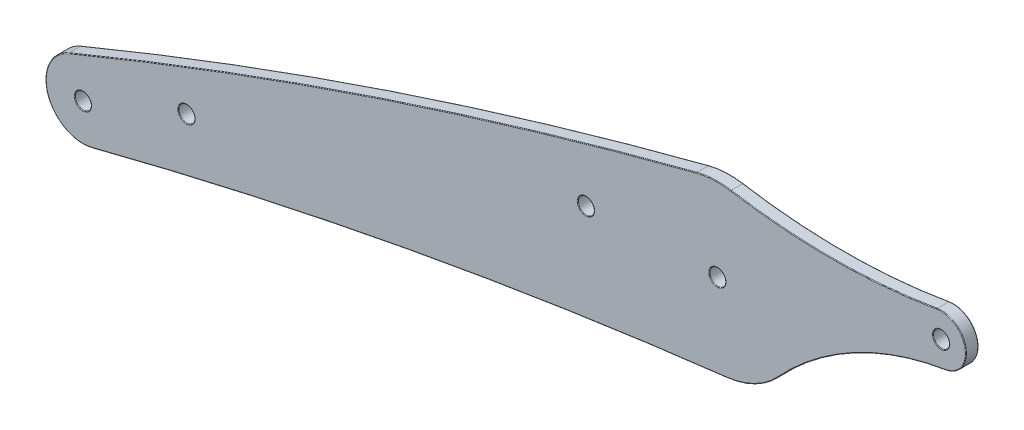
ISO-10303-21;
HEADER;
FILE_DESCRIPTION(('STEP AP214'),'2;1');
FILE_NAME('part.step','',(''),(''),'','','');
FILE_SCHEMA(('AUTOMOTIVE_DESIGN { 1 0 10303 214 1 1 1 1 }'));
ENDSEC;
DATA;
#1=APPLICATION_CONTEXT('core data for automotive mechanical design processes');
#2=APPLICATION_PROTOCOL_DEFINITION('international standard','automotive_design',2000,#1);
#3=PRODUCT_CONTEXT('',#1,'mechanical');
#4=PRODUCT('Part','Part','',(#3));
#5=PRODUCT_RELATED_PRODUCT_CATEGORY('part','',(#4));
#6=PRODUCT_DEFINITION_FORMATION('','',#4);
#7=PRODUCT_DEFINITION_CONTEXT('part definition',#1,'design');
#8=PRODUCT_DEFINITION('design','',#6,#7);
#9=PRODUCT_DEFINITION_SHAPE('','',#8);
#10=(LENGTH_UNIT() NAMED_UNIT(*) SI_UNIT(.MILLI.,.METRE.));
#11=(NAMED_UNIT(*) PLANE_ANGLE_UNIT() SI_UNIT($,.RADIAN.));
#12=(NAMED_UNIT(*) SI_UNIT($,.STERADIAN.) SOLID_ANGLE_UNIT());
#13=UNCERTAINTY_MEASURE_WITH_UNIT(LENGTH_MEASURE(1.E-05),#10,'distance_accuracy_value','');
#14=(GEOMETRIC_REPRESENTATION_CONTEXT(3) GLOBAL_UNCERTAINTY_ASSIGNED_CONTEXT((#13)) GLOBAL_UNIT_ASSIGNED_CONTEXT((#10,
#11,#12)) REPRESENTATION_CONTEXT('',''));
#15=CARTESIAN_POINT('',(0.,0.,0.));
#16=DIRECTION('',(0.,0.,1.));
#17=DIRECTION('',(1.,0.,0.));
#18=AXIS2_PLACEMENT_3D('',#15,#16,#17);
#19=CARTESIAN_POINT('',(-11.0780148603004,289.384113579825,0.));
#20=DIRECTION('',(0.,0.,-1.));
#21=DIRECTION('',(-1.,0.,0.));
#22=AXIS2_PLACEMENT_3D('',#19,#20,#21);
#23=PLANE('',#22);
#24=CARTESIAN_POINT('',(-177.991557982178,165.76962250211,0.));
#25=DIRECTION('',(0.,0.,-1.));
#26=DIRECTION('',(-1.,0.,0.));
#27=AXIS2_PLACEMENT_3D('',#24,#25,#26);
#28=CIRCLE('',#27,2.10000000000001);
#29=CARTESIAN_POINT('',(-180.091557982178,165.76962250211,0.));
#30=VERTEX_POINT('',#29);
#31=EDGE_CURVE('E11',#30,#30,#28,.T.);
#32=ORIENTED_EDGE('',*,*,#31,.T.);
#33=EDGE_LOOP('',(#32));
#34=FACE_BOUND('',#33,.T.);
#35=CARTESIAN_POINT('',(-152.991557982178,175.545617404976,0.));
#36=DIRECTION('',(0.,0.,-1.));
#37=DIRECTION('',(-1.,0.,0.));
#38=AXIS2_PLACEMENT_3D('',#35,#36,#37);
#39=CIRCLE('',#38,2.10000000000001);
#40=CARTESIAN_POINT('',(-155.091557982178,175.545617404976,0.));
#41=VERTEX_POINT('',#40);
#42=EDGE_CURVE('E42',#41,#41,#39,.T.);
#43=ORIENTED_EDGE('',*,*,#42,.T.);
#44=EDGE_LOOP('',(#43));
#45=FACE_BOUND('',#44,.T.);
#46=CARTESIAN_POINT('',(-56.5865231427907,204.525451112236,0.));
#47=DIRECTION('',(0.,0.,-1.));
#48=DIRECTION('',(-1.,0.,0.));
#49=AXIS2_PLACEMENT_3D('',#46,#47,#48);
#50=CIRCLE('',#49,2.1);
#51=CARTESIAN_POINT('',(-58.6865231427907,204.525451112236,0.));
#52=VERTEX_POINT('',#51);
#53=EDGE_CURVE('E296',#52,#52,#50,.T.);
#54=ORIENTED_EDGE('',*,*,#53,.T.);
#55=EDGE_LOOP('',(#54));
#56=FACE_BOUND('',#55,.T.);
#57=CARTESIAN_POINT('',(-24.8517146991871,205.507506633977,0.));
#58=DIRECTION('',(0.,0.,-1.));
#59=DIRECTION('',(-1.,0.,0.));
#60=AXIS2_PLACEMENT_3D('',#57,#58,#59);
#61=CIRCLE('',#60,2.1);
#62=CARTESIAN_POINT('',(-26.9517146991871,205.507506633977,0.));
#63=VERTEX_POINT('',#62);
#64=EDGE_CURVE('E293',#63,#63,#61,.T.);
#65=ORIENTED_EDGE('',*,*,#64,.T.);
#66=EDGE_LOOP('',(#65));
#67=FACE_BOUND('',#66,.T.);
#68=CARTESIAN_POINT('',(29.1482853008129,219.519834824463,0.));
#69=DIRECTION('',(0.,0.,-1.));
#70=DIRECTION('',(-1.,0.,0.));
#71=AXIS2_PLACEMENT_3D('',#68,#69,#70);
#72=CIRCLE('',#71,2.1);
#73=CARTESIAN_POINT('',(27.0482853008129,219.519834824463,0.));
#74=VERTEX_POINT('',#73);
#75=EDGE_CURVE('E290',#74,#74,#72,.T.);
#76=ORIENTED_EDGE('',*,*,#75,.T.);
#77=EDGE_LOOP('',(#76));
#78=FACE_BOUND('',#77,.T.);
#79=CARTESIAN_POINT('',(29.1482853008129,219.519834824463,0.));
#80=DIRECTION('',(0.,0.,-1.));
#81=DIRECTION('',(-1.,0.,0.));
#82=AXIS2_PLACEMENT_3D('',#79,#80,#81);
#83=CIRCLE('',#82,5.85000000000002);
#84=CARTESIAN_POINT('',(30.0848388911669,213.745290048258,0.));
#85=VERTEX_POINT('',#84);
#86=CARTESIAN_POINT('',(28.1563127887294,225.285118038258,0.));
#87=VERTEX_POINT('',#86);
#88=EDGE_CURVE('E50',#85,#87,#83,.F.);
#89=ORIENTED_EDGE('',*,*,#88,.T.);
#90=CARTESIAN_POINT('',(2.69568497858623,373.260720525673,0.));
#91=DIRECTION('',(0.,0.,-1.));
#92=DIRECTION('',(-1.,0.,0.));
#93=AXIS2_PLACEMENT_3D('',#90,#91,#92);
#94=CIRCLE('',#93,150.15);
#95=CARTESIAN_POINT('',(-21.6351506779884,225.095161314861,0.));
#96=VERTEX_POINT('',#95);
#97=EDGE_CURVE('E288',#87,#96,#94,.T.);
#98=ORIENTED_EDGE('',*,*,#97,.T.);
#99=CARTESIAN_POINT('',(-24.8517146991871,205.507506633977,0.));
#100=DIRECTION('',(0.,0.,-1.));
#101=DIRECTION('',(-1.,0.,0.));
#102=AXIS2_PLACEMENT_3D('',#99,#100,#101);
#103=CIRCLE('',#102,19.85);
#104=CARTESIAN_POINT('',(-29.8347415885378,224.721874773992,0.));
#105=VERTEX_POINT('',#104);
#106=EDGE_CURVE('E276',#96,#105,#103,.F.);
#107=ORIENTED_EDGE('',*,*,#106,.T.);
#108=CARTESIAN_POINT('',(258.816818548486,-888.307908893301,0.));
#109=DIRECTION('',(0.,0.,-1.));
#110=DIRECTION('',(-1.,0.,0.));
#111=AXIS2_PLACEMENT_3D('',#108,#109,#110);
#112=CIRCLE('',#111,1149.85);
#113=CARTESIAN_POINT('',(-181.379598413638,173.945421058508,0.));
#114=VERTEX_POINT('',#113);
#115=EDGE_CURVE('E278',#105,#114,#112,.F.);
#116=ORIENTED_EDGE('',*,*,#115,.T.);
#117=CARTESIAN_POINT('',(-177.991557982178,165.76962250211,0.));
#118=DIRECTION('',(0.,0.,-1.));
#119=DIRECTION('',(-1.,0.,0.));
#120=AXIS2_PLACEMENT_3D('',#117,#118,#119);
#121=CIRCLE('',#120,8.8499999999999);
#122=CARTESIAN_POINT('',(-175.782450037665,157.199771739729,0.));
#123=VERTEX_POINT('',#122);
#124=EDGE_CURVE('E280',#114,#123,#121,.F.);
#125=ORIENTED_EDGE('',*,*,#124,.T.);
#126=CARTESIAN_POINT('',(111.314216898068,-956.541906718248,0.));
#127=DIRECTION('',(0.,0.,-1.));
#128=DIRECTION('',(-1.,0.,0.));
#129=AXIS2_PLACEMENT_3D('',#126,#127,#128);
#130=CIRCLE('',#129,1150.15);
#131=CARTESIAN_POINT('',(-22.5415491075585,185.792394792061,0.));
#132=VERTEX_POINT('',#131);
#133=EDGE_CURVE('E282',#123,#132,#130,.T.);
#134=ORIENTED_EDGE('',*,*,#133,.T.);
#135=CARTESIAN_POINT('',(-24.8517146991871,205.507506633977,0.));
#136=DIRECTION('',(0.,0.,-1.));
#137=DIRECTION('',(-1.,0.,0.));
#138=AXIS2_PLACEMENT_3D('',#135,#136,#137);
#139=CIRCLE('',#138,19.8500000000001);
#140=CARTESIAN_POINT('',(-10.2581729206342,192.051985894978,0.));
#141=VERTEX_POINT('',#140);
#142=EDGE_CURVE('E284',#132,#141,#139,.F.);
#143=ORIENTED_EDGE('',*,*,#142,.T.);
#144=CARTESIAN_POINT('',(41.3154772438735,144.500107817357,0.));
#145=DIRECTION('',(0.,0.,-1.));
#146=DIRECTION('',(-1.,0.,0.));
#147=AXIS2_PLACEMENT_3D('',#144,#145,#146);
#148=CIRCLE('',#147,70.15);
#149=EDGE_CURVE('E55',#141,#85,#148,.T.);
#150=ORIENTED_EDGE('',*,*,#149,.T.);
#151=EDGE_LOOP('',(#89,#98,#107,#116,#125,#134,#143,#150));
#152=FACE_BOUND('',#151,.T.);
#153=ADVANCED_FACE('F33',(#34,#45,#56,#67,#78,#152),#23,.F.);
#154=CARTESIAN_POINT('',(-24.8517146991871,205.507506633977,-3.));
#155=DIRECTION('',(0.,0.,1.));
#156=DIRECTION('',(1.,0.,0.));
#157=AXIS2_PLACEMENT_3D('',#154,#155,#156);
#158=CYLINDRICAL_SURFACE('',#157,20.);
#159=DIRECTION('',(0.,0.,1.));
#160=VECTOR('',#159,1.);
#161=CARTESIAN_POINT('',(-21.6108441488609,225.24317885653,-3.));
#162=LINE('',#161,#160);
#163=CARTESIAN_POINT('',(-21.6108441488609,225.24317885653,-2.85));
#164=VERTEX_POINT('',#163);
#165=CARTESIAN_POINT('',(-21.6108441488609,225.24317885653,-0.15));
#166=VERTEX_POINT('',#165);
#167=EDGE_CURVE('E155',#164,#166,#162,.T.);
#168=ORIENTED_EDGE('',*,*,#167,.F.);
#169=CARTESIAN_POINT('',(-24.8517146991871,205.507506633977,-2.85));
#170=DIRECTION('',(0.,0.,-1.));
#171=DIRECTION('',(-1.,0.,0.));
#172=AXIS2_PLACEMENT_3D('',#169,#170,#171);
#173=CIRCLE('',#172,20.);
#174=CARTESIAN_POINT('',(-29.8723967035707,224.867071510566,-2.85));
#175=VERTEX_POINT('',#174);
#176=EDGE_CURVE('E149',#164,#175,#173,.F.);
#177=ORIENTED_EDGE('',*,*,#176,.T.);
#178=DIRECTION('',(0.,0.,1.));
#179=VECTOR('',#178,1.);
#180=CARTESIAN_POINT('',(-29.8723967035707,224.867071510566,-3.));
#181=LINE('',#180,#179);
#182=CARTESIAN_POINT('',(-29.8723967035707,224.867071510566,-0.15));
#183=VERTEX_POINT('',#182);
#184=EDGE_CURVE('E152',#175,#183,#181,.T.);
#185=ORIENTED_EDGE('',*,*,#184,.T.);
#186=CARTESIAN_POINT('',(-24.8517146991871,205.507506633977,-0.15));
#187=DIRECTION('',(0.,0.,-1.));
#188=DIRECTION('',(-1.,0.,0.));
#189=AXIS2_PLACEMENT_3D('',#186,#187,#188);
#190=CIRCLE('',#189,20.);
#191=EDGE_CURVE('E161',#183,#166,#190,.T.);
#192=ORIENTED_EDGE('',*,*,#191,.T.);
#193=EDGE_LOOP('',(#168,#177,#185,#192));
#194=FACE_BOUND('',#193,.T.);
#195=ADVANCED_FACE('F151',(#194),#158,.T.);
#196=CARTESIAN_POINT('',(2.69568497858623,373.260720525673,-3.));
#197=DIRECTION('',(0.,0.,1.));
#198=DIRECTION('',(1.,0.,0.));
#199=AXIS2_PLACEMENT_3D('',#196,#197,#198);
#200=CYLINDRICAL_SURFACE('',#199,150.);
#201=DIRECTION('',(0.,0.,1.));
#202=VECTOR('',#201,1.);
#203=CARTESIAN_POINT('',(28.1308775961118,225.432945812971,-3.));
#204=LINE('',#203,#202);
#205=CARTESIAN_POINT('',(28.1308775961118,225.432945812971,-2.85));
#206=VERTEX_POINT('',#205);
#207=CARTESIAN_POINT('',(28.1308775961118,225.432945812971,-0.15));
#208=VERTEX_POINT('',#207);
#209=EDGE_CURVE('E369',#206,#208,#204,.T.);
#210=ORIENTED_EDGE('',*,*,#209,.F.);
#211=CARTESIAN_POINT('',(2.69568497858623,373.260720525673,-2.85));
#212=DIRECTION('',(0.,0.,-1.));
#213=DIRECTION('',(-1.,0.,0.));
#214=AXIS2_PLACEMENT_3D('',#211,#212,#213);
#215=CIRCLE('',#214,150.);
#216=EDGE_CURVE('E244',#206,#164,#215,.T.);
#217=ORIENTED_EDGE('',*,*,#216,.T.);
#218=ORIENTED_EDGE('',*,*,#167,.T.);
#219=CARTESIAN_POINT('',(2.69568497858623,373.260720525673,-0.15));
#220=DIRECTION('',(0.,0.,-1.));
#221=DIRECTION('',(-1.,0.,0.));
#222=AXIS2_PLACEMENT_3D('',#219,#220,#221);
#223=CIRCLE('',#222,150.);
#224=EDGE_CURVE('E241',#166,#208,#223,.F.);
#225=ORIENTED_EDGE('',*,*,#224,.T.);
#226=EDGE_LOOP('',(#210,#217,#218,#225));
#227=FACE_BOUND('',#226,.T.);
#228=ADVANCED_FACE('F375',(#227),#200,.F.);
#229=CARTESIAN_POINT('',(29.1482853008129,219.519834824463,-3.));
#230=DIRECTION('',(0.,0.,1.));
#231=DIRECTION('',(1.,0.,0.));
#232=AXIS2_PLACEMENT_3D('',#229,#230,#231);
#233=CYLINDRICAL_SURFACE('',#232,6.00000000000002);
#234=DIRECTION('',(0.,0.,1.));
#235=VECTOR('',#234,1.);
#236=CARTESIAN_POINT('',(30.1088530857914,213.597224797586,-3.));
#237=LINE('',#236,#235);
#238=CARTESIAN_POINT('',(30.1088530857914,213.597224797586,-2.85));
#239=VERTEX_POINT('',#238);
#240=CARTESIAN_POINT('',(30.1088530857914,213.597224797586,-0.15));
#241=VERTEX_POINT('',#240);
#242=EDGE_CURVE('E366',#239,#241,#237,.T.);
#243=ORIENTED_EDGE('',*,*,#242,.F.);
#244=CARTESIAN_POINT('',(29.1482853008129,219.519834824463,-2.85));
#245=DIRECTION('',(0.,0.,-1.));
#246=DIRECTION('',(-1.,0.,0.));
#247=AXIS2_PLACEMENT_3D('',#244,#245,#246);
#248=CIRCLE('',#247,6.00000000000002);
#249=EDGE_CURVE('E239',#239,#206,#248,.F.);
#250=ORIENTED_EDGE('',*,*,#249,.T.);
#251=ORIENTED_EDGE('',*,*,#209,.T.);
#252=CARTESIAN_POINT('',(29.1482853008129,219.519834824463,-0.15));
#253=DIRECTION('',(0.,0.,-1.));
#254=DIRECTION('',(-1.,0.,0.));
#255=AXIS2_PLACEMENT_3D('',#252,#253,#254);
#256=CIRCLE('',#255,6.00000000000002);
#257=EDGE_CURVE('E237',#208,#241,#256,.T.);
#258=ORIENTED_EDGE('',*,*,#257,.T.);
#259=EDGE_LOOP('',(#243,#250,#251,#258));
#260=FACE_BOUND('',#259,.T.);
#261=ADVANCED_FACE('F401',(#260),#233,.T.);
#262=CARTESIAN_POINT('',(41.3154772438735,144.500107817357,-3.));
#263=DIRECTION('',(0.,0.,1.));
#264=DIRECTION('',(1.,0.,0.));
#265=AXIS2_PLACEMENT_3D('',#262,#263,#264);
#266=CYLINDRICAL_SURFACE('',#265,70.);
#267=DIRECTION('',(0.,0.,1.));
#268=VECTOR('',#267,1.);
#269=CARTESIAN_POINT('',(-10.1478942673958,191.95030689695,-3.));
#270=LINE('',#269,#268);
#271=CARTESIAN_POINT('',(-10.1478942673958,191.95030689695,-2.85));
#272=VERTEX_POINT('',#271);
#273=CARTESIAN_POINT('',(-10.1478942673958,191.95030689695,-0.15));
#274=VERTEX_POINT('',#273);
#275=EDGE_CURVE('E360',#272,#274,#270,.T.);
#276=ORIENTED_EDGE('',*,*,#275,.F.);
#277=CARTESIAN_POINT('',(41.3154772438735,144.500107817357,-2.85));
#278=DIRECTION('',(0.,0.,-1.));
#279=DIRECTION('',(-1.,0.,0.));
#280=AXIS2_PLACEMENT_3D('',#277,#278,#279);
#281=CIRCLE('',#280,70.);
#282=EDGE_CURVE('E235',#272,#239,#281,.T.);
#283=ORIENTED_EDGE('',*,*,#282,.T.);
#284=ORIENTED_EDGE('',*,*,#242,.T.);
#285=CARTESIAN_POINT('',(41.3154772438735,144.500107817357,-0.15));
#286=DIRECTION('',(0.,0.,-1.));
#287=DIRECTION('',(-1.,0.,0.));
#288=AXIS2_PLACEMENT_3D('',#285,#286,#287);
#289=CIRCLE('',#288,70.);
#290=EDGE_CURVE('E233',#241,#274,#289,.F.);
#291=ORIENTED_EDGE('',*,*,#290,.T.);
#292=EDGE_LOOP('',(#276,#283,#284,#291));
#293=FACE_BOUND('',#292,.T.);
#294=ADVANCED_FACE('F404',(#293),#266,.F.);
#295=CARTESIAN_POINT('',(-24.8517146991871,205.507506633977,-3.));
#296=DIRECTION('',(0.,0.,1.));
#297=DIRECTION('',(1.,0.,0.));
#298=AXIS2_PLACEMENT_3D('',#295,#296,#297);
#299=CYLINDRICAL_SURFACE('',#298,20.0000000000001);
#300=DIRECTION('',(0.,0.,1.));
#301=VECTOR('',#300,1.);
#302=CARTESIAN_POINT('',(-22.5240919368409,185.643414098042,-3.));
#303=LINE('',#302,#301);
#304=CARTESIAN_POINT('',(-22.5240919368409,185.643414098042,-2.85));
#305=VERTEX_POINT('',#304);
#306=CARTESIAN_POINT('',(-22.5240919368409,185.643414098042,-0.15));
#307=VERTEX_POINT('',#306);
#308=EDGE_CURVE('E356',#305,#307,#303,.T.);
#309=ORIENTED_EDGE('',*,*,#308,.F.);
#310=CARTESIAN_POINT('',(-24.8517146991871,205.507506633977,-2.85));
#311=DIRECTION('',(0.,0.,-1.));
#312=DIRECTION('',(-1.,0.,0.));
#313=AXIS2_PLACEMENT_3D('',#310,#311,#312);
#314=CIRCLE('',#313,20.0000000000001);
#315=EDGE_CURVE('E231',#305,#272,#314,.F.);
#316=ORIENTED_EDGE('',*,*,#315,.T.);
#317=ORIENTED_EDGE('',*,*,#275,.T.);
#318=CARTESIAN_POINT('',(-24.8517146991871,205.507506633977,-0.15));
#319=DIRECTION('',(0.,0.,-1.));
#320=DIRECTION('',(-1.,0.,0.));
#321=AXIS2_PLACEMENT_3D('',#318,#319,#320);
#322=CIRCLE('',#321,20.0000000000001);
#323=EDGE_CURVE('E229',#274,#307,#322,.T.);
#324=ORIENTED_EDGE('',*,*,#323,.T.);
#325=EDGE_LOOP('',(#309,#316,#317,#324));
#326=FACE_BOUND('',#325,.T.);
#327=ADVANCED_FACE('F408',(#326),#299,.T.);
#328=CARTESIAN_POINT('',(111.314216898068,-956.541906718248,-3.));
#329=DIRECTION('',(0.,0.,1.));
#330=DIRECTION('',(1.,0.,0.));
#331=AXIS2_PLACEMENT_3D('',#328,#329,#330);
#332=CYLINDRICAL_SURFACE('',#331,1150.);
#333=DIRECTION('',(0.,0.,1.));
#334=VECTOR('',#333,1.);
#335=CARTESIAN_POINT('',(-175.745007530131,157.054520031892,-3.));
#336=LINE('',#335,#334);
#337=CARTESIAN_POINT('',(-175.745007530131,157.054520031892,-2.85));
#338=VERTEX_POINT('',#337);
#339=CARTESIAN_POINT('',(-175.745007530131,157.054520031892,-0.15));
#340=VERTEX_POINT('',#339);
#341=EDGE_CURVE('E353',#338,#340,#336,.T.);
#342=ORIENTED_EDGE('',*,*,#341,.F.);
#343=CARTESIAN_POINT('',(111.314216898068,-956.541906718248,-2.85));
#344=DIRECTION('',(0.,0.,-1.));
#345=DIRECTION('',(-1.,0.,0.));
#346=AXIS2_PLACEMENT_3D('',#343,#344,#345);
#347=CIRCLE('',#346,1150.);
#348=EDGE_CURVE('E227',#338,#305,#347,.T.);
#349=ORIENTED_EDGE('',*,*,#348,.T.);
#350=ORIENTED_EDGE('',*,*,#308,.T.);
#351=CARTESIAN_POINT('',(111.314216898068,-956.541906718248,-0.15));
#352=DIRECTION('',(0.,0.,-1.));
#353=DIRECTION('',(-1.,0.,0.));
#354=AXIS2_PLACEMENT_3D('',#351,#352,#353);
#355=CIRCLE('',#354,1150.);
#356=EDGE_CURVE('E225',#307,#340,#355,.F.);
#357=ORIENTED_EDGE('',*,*,#356,.T.);
#358=EDGE_LOOP('',(#342,#349,#350,#357));
#359=FACE_BOUND('',#358,.T.);
#360=ADVANCED_FACE('F352',(#359),#332,.F.);
#361=CARTESIAN_POINT('',(-177.991557982178,165.76962250211,-3.));
#362=DIRECTION('',(0.,0.,1.));
#363=DIRECTION('',(1.,0.,0.));
#364=AXIS2_PLACEMENT_3D('',#361,#362,#363);
#365=CYLINDRICAL_SURFACE('',#364,8.9999999999999);
#366=DIRECTION('',(0.,0.,1.));
#367=VECTOR('',#366,1.);
#368=CARTESIAN_POINT('',(-181.437022827731,174.083993915396,-3.));
#369=LINE('',#368,#367);
#370=CARTESIAN_POINT('',(-181.437022827731,174.083993915396,-2.85));
#371=VERTEX_POINT('',#370);
#372=CARTESIAN_POINT('',(-181.437022827731,174.083993915396,-0.15));
#373=VERTEX_POINT('',#372);
#374=EDGE_CURVE('E172',#371,#373,#369,.T.);
#375=ORIENTED_EDGE('',*,*,#374,.F.);
#376=CARTESIAN_POINT('',(-177.991557982178,165.76962250211,-2.85));
#377=DIRECTION('',(0.,0.,-1.));
#378=DIRECTION('',(-1.,0.,0.));
#379=AXIS2_PLACEMENT_3D('',#376,#377,#378);
#380=CIRCLE('',#379,8.9999999999999);
#381=EDGE_CURVE('E223',#371,#338,#380,.F.);
#382=ORIENTED_EDGE('',*,*,#381,.T.);
#383=ORIENTED_EDGE('',*,*,#341,.T.);
#384=CARTESIAN_POINT('',(-177.991557982178,165.76962250211,-0.15));
#385=DIRECTION('',(0.,0.,-1.));
#386=DIRECTION('',(-1.,0.,0.));
#387=AXIS2_PLACEMENT_3D('',#384,#385,#386);
#388=CIRCLE('',#387,8.9999999999999);
#389=EDGE_CURVE('E221',#340,#373,#388,.T.);
#390=ORIENTED_EDGE('',*,*,#389,.T.);
#391=EDGE_LOOP('',(#375,#382,#383,#390));
#392=FACE_BOUND('',#391,.T.);
#393=ADVANCED_FACE('F358',(#392),#365,.T.);
#394=CARTESIAN_POINT('',(258.816818548486,-888.307908893301,-3.));
#395=DIRECTION('',(0.,0.,1.));
#396=DIRECTION('',(1.,0.,0.));
#397=AXIS2_PLACEMENT_3D('',#394,#395,#396);
#398=CYLINDRICAL_SURFACE('',#397,1150.);
#399=ORIENTED_EDGE('',*,*,#184,.F.);
#400=CARTESIAN_POINT('',(258.816818548486,-888.307908893301,-2.85));
#401=DIRECTION('',(0.,0.,-1.));
#402=DIRECTION('',(-1.,0.,0.));
#403=AXIS2_PLACEMENT_3D('',#400,#401,#402);
#404=CIRCLE('',#403,1150.);
#405=EDGE_CURVE('E168',#175,#371,#404,.F.);
#406=ORIENTED_EDGE('',*,*,#405,.T.);
#407=ORIENTED_EDGE('',*,*,#374,.T.);
#408=CARTESIAN_POINT('',(258.816818548486,-888.307908893301,-0.15));
#409=DIRECTION('',(0.,0.,-1.));
#410=DIRECTION('',(-1.,0.,0.));
#411=AXIS2_PLACEMENT_3D('',#408,#409,#410);
#412=CIRCLE('',#411,1150.);
#413=EDGE_CURVE('E171',#373,#183,#412,.T.);
#414=ORIENTED_EDGE('',*,*,#413,.T.);
#415=EDGE_LOOP('',(#399,#406,#407,#414));
#416=FACE_BOUND('',#415,.T.);
#417=ADVANCED_FACE('F165',(#416),#398,.T.);
#418=CARTESIAN_POINT('',(-11.0780148603004,289.384113579825,-3.));
#419=DIRECTION('',(0.,0.,-1.));
#420=DIRECTION('',(-1.,0.,0.));
#421=AXIS2_PLACEMENT_3D('',#418,#419,#420);
#422=PLANE('',#421);
#423=CARTESIAN_POINT('',(-177.991557982178,165.76962250211,-3.));
#424=DIRECTION('',(0.,0.,-1.));
#425=DIRECTION('',(-1.,0.,0.));
#426=AXIS2_PLACEMENT_3D('',#423,#424,#425);
#427=CIRCLE('',#426,8.8499999999999);
#428=CARTESIAN_POINT('',(-175.782450037665,157.199771739729,-3.));
#429=VERTEX_POINT('',#428);
#430=CARTESIAN_POINT('',(-181.379598413638,173.945421058508,-3.));
#431=VERTEX_POINT('',#430);
#432=EDGE_CURVE('E217',#429,#431,#427,.T.);
#433=ORIENTED_EDGE('',*,*,#432,.T.);
#434=CARTESIAN_POINT('',(258.816818548486,-888.307908893301,-3.));
#435=DIRECTION('',(0.,0.,-1.));
#436=DIRECTION('',(-1.,0.,0.));
#437=AXIS2_PLACEMENT_3D('',#434,#435,#436);
#438=CIRCLE('',#437,1149.85);
#439=CARTESIAN_POINT('',(-29.8347415885378,224.721874773992,-3.));
#440=VERTEX_POINT('',#439);
#441=EDGE_CURVE('E219',#431,#440,#438,.T.);
#442=ORIENTED_EDGE('',*,*,#441,.T.);
#443=CARTESIAN_POINT('',(-24.8517146991871,205.507506633977,-3.));
#444=DIRECTION('',(0.,0.,-1.));
#445=DIRECTION('',(-1.,0.,0.));
#446=AXIS2_PLACEMENT_3D('',#443,#444,#445);
#447=CIRCLE('',#446,19.85);
#448=CARTESIAN_POINT('',(-21.6351506779884,225.095161314861,-3.));
#449=VERTEX_POINT('',#448);
#450=EDGE_CURVE('E178',#440,#449,#447,.T.);
#451=ORIENTED_EDGE('',*,*,#450,.T.);
#452=CARTESIAN_POINT('',(2.69568497858623,373.260720525673,-3.));
#453=DIRECTION('',(0.,0.,-1.));
#454=DIRECTION('',(-1.,0.,0.));
#455=AXIS2_PLACEMENT_3D('',#452,#453,#454);
#456=CIRCLE('',#455,150.15);
#457=CARTESIAN_POINT('',(28.1563127887294,225.285118038258,-3.));
#458=VERTEX_POINT('',#457);
#459=EDGE_CURVE('E207',#449,#458,#456,.F.);
#460=ORIENTED_EDGE('',*,*,#459,.T.);
#461=CARTESIAN_POINT('',(29.1482853008129,219.519834824463,-3.));
#462=DIRECTION('',(0.,0.,-1.));
#463=DIRECTION('',(-1.,0.,0.));
#464=AXIS2_PLACEMENT_3D('',#461,#462,#463);
#465=CIRCLE('',#464,5.85000000000002);
#466=CARTESIAN_POINT('',(30.0848388911669,213.745290048258,-3.));
#467=VERTEX_POINT('',#466);
#468=EDGE_CURVE('E209',#458,#467,#465,.T.);
#469=ORIENTED_EDGE('',*,*,#468,.T.);
#470=CARTESIAN_POINT('',(41.3154772438735,144.500107817357,-3.));
#471=DIRECTION('',(0.,0.,-1.));
#472=DIRECTION('',(-1.,0.,0.));
#473=AXIS2_PLACEMENT_3D('',#470,#471,#472);
#474=CIRCLE('',#473,70.15);
#475=CARTESIAN_POINT('',(-10.2581729206343,192.051985894978,-3.));
#476=VERTEX_POINT('',#475);
#477=EDGE_CURVE('E211',#467,#476,#474,.F.);
#478=ORIENTED_EDGE('',*,*,#477,.T.);
#479=CARTESIAN_POINT('',(-24.8517146991871,205.507506633977,-3.));
#480=DIRECTION('',(0.,0.,-1.));
#481=DIRECTION('',(-1.,0.,0.));
#482=AXIS2_PLACEMENT_3D('',#479,#480,#481);
#483=CIRCLE('',#482,19.8500000000001);
#484=CARTESIAN_POINT('',(-22.5415491075585,185.792394792061,-3.));
#485=VERTEX_POINT('',#484);
#486=EDGE_CURVE('E213',#476,#485,#483,.T.);
#487=ORIENTED_EDGE('',*,*,#486,.T.);
#488=CARTESIAN_POINT('',(111.314216898068,-956.541906718248,-3.));
#489=DIRECTION('',(0.,0.,-1.));
#490=DIRECTION('',(-1.,0.,0.));
#491=AXIS2_PLACEMENT_3D('',#488,#489,#490);
#492=CIRCLE('',#491,1150.15);
#493=EDGE_CURVE('E215',#485,#429,#492,.F.);
#494=ORIENTED_EDGE('',*,*,#493,.T.);
#495=EDGE_LOOP('',(#433,#442,#451,#460,#469,#478,#487,#494));
#496=FACE_BOUND('',#495,.T.);
#497=CARTESIAN_POINT('',(29.1482853008129,219.519834824463,-3.));
#498=DIRECTION('',(0.,0.,-1.));
#499=DIRECTION('',(-1.,0.,0.));
#500=AXIS2_PLACEMENT_3D('',#497,#498,#499);
#501=CIRCLE('',#500,2.1);
#502=CARTESIAN_POINT('',(27.0482853008129,219.519834824463,-3.));
#503=VERTEX_POINT('',#502);
#504=EDGE_CURVE('E203',#503,#503,#501,.F.);
#505=ORIENTED_EDGE('',*,*,#504,.T.);
#506=EDGE_LOOP('',(#505));
#507=FACE_BOUND('',#506,.T.);
#508=CARTESIAN_POINT('',(-24.8517146991871,205.507506633977,-3.));
#509=DIRECTION('',(0.,0.,-1.));
#510=DIRECTION('',(-1.,0.,0.));
#511=AXIS2_PLACEMENT_3D('',#508,#509,#510);
#512=CIRCLE('',#511,2.1);
#513=CARTESIAN_POINT('',(-26.9517146991871,205.507506633977,-3.));
#514=VERTEX_POINT('',#513);
#515=EDGE_CURVE('E200',#514,#514,#512,.F.);
#516=ORIENTED_EDGE('',*,*,#515,.T.);
#517=EDGE_LOOP('',(#516));
#518=FACE_BOUND('',#517,.T.);
#519=CARTESIAN_POINT('',(-56.5865231427907,204.525451112236,-3.));
#520=DIRECTION('',(0.,0.,-1.));
#521=DIRECTION('',(-1.,0.,0.));
#522=AXIS2_PLACEMENT_3D('',#519,#520,#521);
#523=CIRCLE('',#522,2.1);
#524=CARTESIAN_POINT('',(-58.6865231427907,204.525451112236,-3.));
#525=VERTEX_POINT('',#524);
#526=EDGE_CURVE('E197',#525,#525,#523,.F.);
#527=ORIENTED_EDGE('',*,*,#526,.T.);
#528=EDGE_LOOP('',(#527));
#529=FACE_BOUND('',#528,.T.);
#530=CARTESIAN_POINT('',(-152.991557982178,175.545617404976,-3.));
#531=DIRECTION('',(0.,0.,-1.));
#532=DIRECTION('',(-1.,0.,0.));
#533=AXIS2_PLACEMENT_3D('',#530,#531,#532);
#534=CIRCLE('',#533,2.10000000000001);
#535=CARTESIAN_POINT('',(-155.091557982178,175.545617404976,-3.));
#536=VERTEX_POINT('',#535);
#537=EDGE_CURVE('E191',#536,#536,#534,.F.);
#538=ORIENTED_EDGE('',*,*,#537,.T.);
#539=EDGE_LOOP('',(#538));
#540=FACE_BOUND('',#539,.T.);
#541=CARTESIAN_POINT('',(-177.991557982178,165.76962250211,-3.));
#542=DIRECTION('',(0.,0.,-1.));
#543=DIRECTION('',(-1.,0.,0.));
#544=AXIS2_PLACEMENT_3D('',#541,#542,#543);
#545=CIRCLE('',#544,2.10000000000001);
#546=CARTESIAN_POINT('',(-180.091557982178,165.76962250211,-3.));
#547=VERTEX_POINT('',#546);
#548=EDGE_CURVE('E188',#547,#547,#545,.F.);
#549=ORIENTED_EDGE('',*,*,#548,.T.);
#550=EDGE_LOOP('',(#549));
#551=FACE_BOUND('',#550,.T.);
#552=ADVANCED_FACE('F397',(#496,#507,#518,#529,#540,#551),#422,.T.);
#553=CARTESIAN_POINT('',(29.1482853008129,219.519834824463,0.));
#554=DIRECTION('',(0.,0.,1.));
#555=DIRECTION('',(1.,0.,0.));
#556=AXIS2_PLACEMENT_3D('',#553,#554,#555);
#557=CYLINDRICAL_SURFACE('',#556,1.95);
#558=CARTESIAN_POINT('',(29.1482853008129,219.519834824463,-2.85));
#559=DIRECTION('',(0.,0.,-1.));
#560=DIRECTION('',(-1.,0.,0.));
#561=AXIS2_PLACEMENT_3D('',#558,#559,#560);
#562=CIRCLE('',#561,1.95);
#563=CARTESIAN_POINT('',(27.1982853008129,219.519834824463,-2.85));
#564=VERTEX_POINT('',#563);
#565=EDGE_CURVE('E249',#564,#564,#562,.T.);
#566=ORIENTED_EDGE('',*,*,#565,.T.);
#567=EDGE_LOOP('',(#566));
#568=FACE_BOUND('',#567,.T.);
#569=CARTESIAN_POINT('',(29.1482853008129,219.519834824463,-0.15));
#570=DIRECTION('',(0.,0.,-1.));
#571=DIRECTION('',(-1.,0.,0.));
#572=AXIS2_PLACEMENT_3D('',#569,#570,#571);
#573=CIRCLE('',#572,1.95);
#574=CARTESIAN_POINT('',(27.1982853008129,219.519834824463,-0.15));
#575=VERTEX_POINT('',#574);
#576=EDGE_CURVE('E160',#575,#575,#573,.F.);
#577=ORIENTED_EDGE('',*,*,#576,.T.);
#578=EDGE_LOOP('',(#577));
#579=FACE_BOUND('',#578,.T.);
#580=ADVANCED_FACE('F614',(#568,#579),#557,.F.);
#581=CARTESIAN_POINT('',(-24.8517146991871,205.507506633977,0.));
#582=DIRECTION('',(0.,0.,1.));
#583=DIRECTION('',(1.,0.,0.));
#584=AXIS2_PLACEMENT_3D('',#581,#582,#583);
#585=CYLINDRICAL_SURFACE('',#584,1.95);
#586=CARTESIAN_POINT('',(-24.8517146991871,205.507506633977,-2.85));
#587=DIRECTION('',(0.,0.,-1.));
#588=DIRECTION('',(-1.,0.,0.));
#589=AXIS2_PLACEMENT_3D('',#586,#587,#588);
#590=CIRCLE('',#589,1.95);
#591=CARTESIAN_POINT('',(-26.8017146991871,205.507506633977,-2.85));
#592=VERTEX_POINT('',#591);
#593=EDGE_CURVE('E255',#592,#592,#590,.T.);
#594=ORIENTED_EDGE('',*,*,#593,.T.);
#595=EDGE_LOOP('',(#594));
#596=FACE_BOUND('',#595,.T.);
#597=CARTESIAN_POINT('',(-24.8517146991871,205.507506633977,-0.15));
#598=DIRECTION('',(0.,0.,-1.));
#599=DIRECTION('',(-1.,0.,0.));
#600=AXIS2_PLACEMENT_3D('',#597,#598,#599);
#601=CIRCLE('',#600,1.95);
#602=CARTESIAN_POINT('',(-26.8017146991871,205.507506633977,-0.15));
#603=VERTEX_POINT('',#602);
#604=EDGE_CURVE('E252',#603,#603,#601,.F.);
#605=ORIENTED_EDGE('',*,*,#604,.T.);
#606=EDGE_LOOP('',(#605));
#607=FACE_BOUND('',#606,.T.);
#608=ADVANCED_FACE('F606',(#596,#607),#585,.F.);
#609=CARTESIAN_POINT('',(-56.5865231427907,204.525451112236,0.));
#610=DIRECTION('',(0.,0.,1.));
#611=DIRECTION('',(1.,0.,0.));
#612=AXIS2_PLACEMENT_3D('',#609,#610,#611);
#613=CYLINDRICAL_SURFACE('',#612,1.95);
#614=CARTESIAN_POINT('',(-56.5865231427907,204.525451112236,-2.85));
#615=DIRECTION('',(0.,0.,-1.));
#616=DIRECTION('',(-1.,0.,0.));
#617=AXIS2_PLACEMENT_3D('',#614,#615,#616);
#618=CIRCLE('',#617,1.95);
#619=CARTESIAN_POINT('',(-58.5365231427907,204.525451112236,-2.85));
#620=VERTEX_POINT('',#619);
#621=EDGE_CURVE('E261',#620,#620,#618,.T.);
#622=ORIENTED_EDGE('',*,*,#621,.T.);
#623=EDGE_LOOP('',(#622));
#624=FACE_BOUND('',#623,.T.);
#625=CARTESIAN_POINT('',(-56.5865231427907,204.525451112236,-0.15));
#626=DIRECTION('',(0.,0.,-1.));
#627=DIRECTION('',(-1.,0.,0.));
#628=AXIS2_PLACEMENT_3D('',#625,#626,#627);
#629=CIRCLE('',#628,1.95);
#630=CARTESIAN_POINT('',(-58.5365231427907,204.525451112236,-0.15));
#631=VERTEX_POINT('',#630);
#632=EDGE_CURVE('E258',#631,#631,#629,.F.);
#633=ORIENTED_EDGE('',*,*,#632,.T.);
#634=EDGE_LOOP('',(#633));
#635=FACE_BOUND('',#634,.T.);
#636=ADVANCED_FACE('F598',(#624,#635),#613,.F.);
#637=CARTESIAN_POINT('',(-152.991557982178,175.545617404976,0.));
#638=DIRECTION('',(0.,0.,1.));
#639=DIRECTION('',(1.,0.,0.));
#640=AXIS2_PLACEMENT_3D('',#637,#638,#639);
#641=CYLINDRICAL_SURFACE('',#640,1.95000000000001);
#642=CARTESIAN_POINT('',(-152.991557982178,175.545617404976,-2.85));
#643=DIRECTION('',(0.,0.,-1.));
#644=DIRECTION('',(-1.,0.,0.));
#645=AXIS2_PLACEMENT_3D('',#642,#643,#644);
#646=CIRCLE('',#645,1.95000000000001);
#647=CARTESIAN_POINT('',(-154.941557982178,175.545617404976,-2.85));
#648=VERTEX_POINT('',#647);
#649=EDGE_CURVE('E267',#648,#648,#646,.T.);
#650=ORIENTED_EDGE('',*,*,#649,.T.);
#651=EDGE_LOOP('',(#650));
#652=FACE_BOUND('',#651,.T.);
#653=CARTESIAN_POINT('',(-152.991557982178,175.545617404976,-0.15));
#654=DIRECTION('',(0.,0.,-1.));
#655=DIRECTION('',(-1.,0.,0.));
#656=AXIS2_PLACEMENT_3D('',#653,#654,#655);
#657=CIRCLE('',#656,1.95000000000001);
#658=CARTESIAN_POINT('',(-154.941557982178,175.545617404976,-0.15));
#659=VERTEX_POINT('',#658);
#660=EDGE_CURVE('E264',#659,#659,#657,.F.);
#661=ORIENTED_EDGE('',*,*,#660,.T.);
#662=EDGE_LOOP('',(#661));
#663=FACE_BOUND('',#662,.T.);
#664=ADVANCED_FACE('F590',(#652,#663),#641,.F.);
#665=CARTESIAN_POINT('',(-177.991557982178,165.76962250211,0.));
#666=DIRECTION('',(0.,0.,1.));
#667=DIRECTION('',(1.,0.,0.));
#668=AXIS2_PLACEMENT_3D('',#665,#666,#667);
#669=CYLINDRICAL_SURFACE('',#668,1.95000000000001);
#670=CARTESIAN_POINT('',(-177.991557982178,165.76962250211,-2.85));
#671=DIRECTION('',(0.,0.,-1.));
#672=DIRECTION('',(-1.,0.,0.));
#673=AXIS2_PLACEMENT_3D('',#670,#671,#672);
#674=CIRCLE('',#673,1.95000000000001);
#675=CARTESIAN_POINT('',(-179.941557982178,165.76962250211,-2.85));
#676=VERTEX_POINT('',#675);
#677=EDGE_CURVE('E273',#676,#676,#674,.T.);
#678=ORIENTED_EDGE('',*,*,#677,.T.);
#679=EDGE_LOOP('',(#678));
#680=FACE_BOUND('',#679,.T.);
#681=CARTESIAN_POINT('',(-177.991557982178,165.76962250211,-0.15));
#682=DIRECTION('',(0.,0.,-1.));
#683=DIRECTION('',(-1.,0.,0.));
#684=AXIS2_PLACEMENT_3D('',#681,#682,#683);
#685=CIRCLE('',#684,1.95000000000001);
#686=CARTESIAN_POINT('',(-179.941557982178,165.76962250211,-0.15));
#687=VERTEX_POINT('',#686);
#688=EDGE_CURVE('E270',#687,#687,#685,.F.);
#689=ORIENTED_EDGE('',*,*,#688,.T.);
#690=EDGE_LOOP('',(#689));
#691=FACE_BOUND('',#690,.T.);
#692=ADVANCED_FACE('F447',(#680,#691),#669,.F.);
#693=CARTESIAN_POINT('',(41.3154772438735,144.500107817357,-2.85));
#694=DIRECTION('',(0.,0.,-1.));
#695=DIRECTION('',(-1.,0.,0.));
#696=AXIS2_PLACEMENT_3D('',#693,#694,#695);
#697=TOROIDAL_SURFACE('',#696,70.15,0.15);
#698=CARTESIAN_POINT('',(-10.2581729206343,192.051985894978,-2.85));
#699=DIRECTION('',(-0.67785998685143,-0.735191021589477,0.));
#700=DIRECTION('',(0.735191021589477,-0.67785998685143,0.));
#701=AXIS2_PLACEMENT_3D('',#698,#699,#700);
#702=CIRCLE('',#701,0.15);
#703=EDGE_CURVE('E312',#476,#272,#702,.T.);
#704=ORIENTED_EDGE('',*,*,#703,.F.);
#705=ORIENTED_EDGE('',*,*,#477,.F.);
#706=CARTESIAN_POINT('',(30.0848388911669,213.745290048258,-2.85));
#707=DIRECTION('',(0.987101671146134,0.160094630829733,0.));
#708=DIRECTION('',(-0.160094630829733,0.987101671146134,0.));
#709=AXIS2_PLACEMENT_3D('',#706,#707,#708);
#710=CIRCLE('',#709,0.15);
#711=EDGE_CURVE('E173',#239,#467,#710,.T.);
#712=ORIENTED_EDGE('',*,*,#711,.F.);
#713=ORIENTED_EDGE('',*,*,#282,.F.);
#714=EDGE_LOOP('',(#704,#705,#712,#713));
#715=FACE_BOUND('',#714,.T.);
#716=ADVANCED_FACE('F443',(#715),#697,.T.);
#717=CARTESIAN_POINT('',(29.1482853008129,219.519834824463,-2.85));
#718=DIRECTION('',(0.,0.,-1.));
#719=DIRECTION('',(-1.,0.,0.));
#720=AXIS2_PLACEMENT_3D('',#717,#718,#719);
#721=TOROIDAL_SURFACE('',#720,5.85000000000002,0.15);
#722=ORIENTED_EDGE('',*,*,#711,.T.);
#723=ORIENTED_EDGE('',*,*,#468,.F.);
#724=CARTESIAN_POINT('',(28.1563127887294,225.285118038258,-2.85));
#725=DIRECTION('',(-0.985518498084678,-0.169567950783514,0.));
#726=DIRECTION('',(0.169567950783514,-0.985518498084678,0.));
#727=AXIS2_PLACEMENT_3D('',#724,#725,#726);
#728=CIRCLE('',#727,0.15);
#729=EDGE_CURVE('E309',#206,#458,#728,.T.);
#730=ORIENTED_EDGE('',*,*,#729,.F.);
#731=ORIENTED_EDGE('',*,*,#249,.F.);
#732=EDGE_LOOP('',(#722,#723,#730,#731));
#733=FACE_BOUND('',#732,.T.);
#734=ADVANCED_FACE('F439',(#733),#721,.T.);
#735=CARTESIAN_POINT('',(-24.8517146991871,205.507506633977,-2.85));
#736=DIRECTION('',(0.,0.,-1.));
#737=DIRECTION('',(-1.,0.,0.));
#738=AXIS2_PLACEMENT_3D('',#735,#736,#737);
#739=TOROIDAL_SURFACE('',#738,19.8500000000001,0.15);
#740=ORIENTED_EDGE('',*,*,#703,.T.);
#741=ORIENTED_EDGE('',*,*,#315,.F.);
#742=CARTESIAN_POINT('',(-22.5415491075585,185.792394792061,-2.85));
#743=DIRECTION('',(-0.993204626796774,-0.116381138117312,0.));
#744=DIRECTION('',(0.116381138117312,-0.993204626796774,0.));
#745=AXIS2_PLACEMENT_3D('',#742,#743,#744);
#746=CIRCLE('',#745,0.15);
#747=EDGE_CURVE('E306',#485,#305,#746,.T.);
#748=ORIENTED_EDGE('',*,*,#747,.F.);
#749=ORIENTED_EDGE('',*,*,#486,.F.);
#750=EDGE_LOOP('',(#740,#741,#748,#749));
#751=FACE_BOUND('',#750,.T.);
#752=ADVANCED_FACE('F435',(#751),#739,.T.);
#753=CARTESIAN_POINT('',(2.69568497858623,373.260720525673,-2.85));
#754=DIRECTION('',(0.,0.,-1.));
#755=DIRECTION('',(-1.,0.,0.));
#756=AXIS2_PLACEMENT_3D('',#753,#754,#755);
#757=TOROIDAL_SURFACE('',#756,150.15,0.15);
#758=ORIENTED_EDGE('',*,*,#729,.T.);
#759=ORIENTED_EDGE('',*,*,#459,.F.);
#760=CARTESIAN_POINT('',(-21.6351506779884,225.095161314861,-2.85));
#761=DIRECTION('',(-0.986783611127622,0.162043527516311,0.));
#762=DIRECTION('',(-0.162043527516311,-0.986783611127622,0.));
#763=AXIS2_PLACEMENT_3D('',#760,#761,#762);
#764=CIRCLE('',#763,0.15);
#765=EDGE_CURVE('E304',#164,#449,#764,.T.);
#766=ORIENTED_EDGE('',*,*,#765,.F.);
#767=ORIENTED_EDGE('',*,*,#216,.F.);
#768=EDGE_LOOP('',(#758,#759,#766,#767));
#769=FACE_BOUND('',#768,.T.);
#770=ADVANCED_FACE('F431',(#769),#757,.T.);
#771=CARTESIAN_POINT('',(111.314216898068,-956.541906718248,-2.85));
#772=DIRECTION('',(0.,0.,-1.));
#773=DIRECTION('',(-1.,0.,0.));
#774=AXIS2_PLACEMENT_3D('',#771,#772,#773);
#775=TOROIDAL_SURFACE('',#774,1150.15,0.15);
#776=ORIENTED_EDGE('',*,*,#747,.T.);
#777=ORIENTED_EDGE('',*,*,#348,.F.);
#778=CARTESIAN_POINT('',(-175.782450037665,157.199771739729,-2.85));
#779=DIRECTION('',(-0.968344718913144,-0.249616716894168,0.));
#780=DIRECTION('',(0.249616716894168,-0.968344718913144,0.));
#781=AXIS2_PLACEMENT_3D('',#778,#779,#780);
#782=CIRCLE('',#781,0.15);
#783=EDGE_CURVE('E182',#429,#338,#782,.T.);
#784=ORIENTED_EDGE('',*,*,#783,.F.);
#785=ORIENTED_EDGE('',*,*,#493,.F.);
#786=EDGE_LOOP('',(#776,#777,#784,#785));
#787=FACE_BOUND('',#786,.T.);
#788=ADVANCED_FACE('F428',(#787),#775,.T.);
#789=CARTESIAN_POINT('',(-24.8517146991871,205.507506633977,-2.85));
#790=DIRECTION('',(0.,0.,-1.));
#791=DIRECTION('',(-1.,0.,0.));
#792=AXIS2_PLACEMENT_3D('',#789,#790,#791);
#793=TOROIDAL_SURFACE('',#792,19.85,0.15);
#794=ORIENTED_EDGE('',*,*,#765,.T.);
#795=ORIENTED_EDGE('',*,*,#450,.F.);
#796=CARTESIAN_POINT('',(-29.8347415885378,224.721874773992,-2.85));
#797=DIRECTION('',(-0.967978243829455,-0.251034100219163,0.));
#798=DIRECTION('',(0.251034100219163,-0.967978243829455,0.));
#799=AXIS2_PLACEMENT_3D('',#796,#797,#798);
#800=CIRCLE('',#799,0.15);
#801=EDGE_CURVE('E176',#175,#440,#800,.T.);
#802=ORIENTED_EDGE('',*,*,#801,.F.);
#803=ORIENTED_EDGE('',*,*,#176,.F.);
#804=EDGE_LOOP('',(#794,#795,#802,#803));
#805=FACE_BOUND('',#804,.T.);
#806=ADVANCED_FACE('F177',(#805),#793,.T.);
#807=CARTESIAN_POINT('',(-177.991557982178,165.76962250211,-2.85));
#808=DIRECTION('',(0.,0.,-1.));
#809=DIRECTION('',(-1.,0.,0.));
#810=AXIS2_PLACEMENT_3D('',#807,#808,#809);
#811=TOROIDAL_SURFACE('',#810,8.8499999999999,0.15);
#812=ORIENTED_EDGE('',*,*,#783,.T.);
#813=ORIENTED_EDGE('',*,*,#381,.F.);
#814=CARTESIAN_POINT('',(-181.379598413638,173.945421058508,-2.85));
#815=DIRECTION('',(0.923819045920635,0.382829427283599,0.));
#816=DIRECTION('',(-0.382829427283599,0.923819045920635,0.));
#817=AXIS2_PLACEMENT_3D('',#814,#815,#816);
#818=CIRCLE('',#817,0.15);
#819=EDGE_CURVE('E183',#431,#371,#818,.T.);
#820=ORIENTED_EDGE('',*,*,#819,.F.);
#821=ORIENTED_EDGE('',*,*,#432,.F.);
#822=EDGE_LOOP('',(#812,#813,#820,#821));
#823=FACE_BOUND('',#822,.T.);
#824=ADVANCED_FACE('F422',(#823),#811,.T.);
#825=CARTESIAN_POINT('',(258.816818548486,-888.307908893301,-2.85));
#826=DIRECTION('',(0.,0.,-1.));
#827=DIRECTION('',(-1.,0.,0.));
#828=AXIS2_PLACEMENT_3D('',#825,#826,#827);
#829=TOROIDAL_SURFACE('',#828,1149.85,0.15);
#830=ORIENTED_EDGE('',*,*,#801,.T.);
#831=ORIENTED_EDGE('',*,*,#441,.F.);
#832=ORIENTED_EDGE('',*,*,#819,.T.);
#833=ORIENTED_EDGE('',*,*,#405,.F.);
#834=EDGE_LOOP('',(#830,#831,#832,#833));
#835=FACE_BOUND('',#834,.T.);
#836=ADVANCED_FACE('F185',(#835),#829,.T.);
#837=CARTESIAN_POINT('',(29.1482853008129,219.519834824463,-2.85));
#838=DIRECTION('',(0.,0.,-1.));
#839=DIRECTION('',(-1.,0.,0.));
#840=AXIS2_PLACEMENT_3D('',#837,#838,#839);
#841=TOROIDAL_SURFACE('',#840,2.1,0.15);
#842=ORIENTED_EDGE('',*,*,#504,.F.);
#843=EDGE_LOOP('',(#842));
#844=FACE_BOUND('',#843,.T.);
#845=ORIENTED_EDGE('',*,*,#565,.F.);
#846=EDGE_LOOP('',(#845));
#847=FACE_BOUND('',#846,.T.);
#848=ADVANCED_FACE('F421',(#844,#847),#841,.T.);
#849=CARTESIAN_POINT('',(-24.8517146991871,205.507506633977,-2.85));
#850=DIRECTION('',(0.,0.,-1.));
#851=DIRECTION('',(-1.,0.,0.));
#852=AXIS2_PLACEMENT_3D('',#849,#850,#851);
#853=TOROIDAL_SURFACE('',#852,2.1,0.15);
#854=ORIENTED_EDGE('',*,*,#515,.F.);
#855=EDGE_LOOP('',(#854));
#856=FACE_BOUND('',#855,.T.);
#857=ORIENTED_EDGE('',*,*,#593,.F.);
#858=EDGE_LOOP('',(#857));
#859=FACE_BOUND('',#858,.T.);
#860=ADVANCED_FACE('F451',(#856,#859),#853,.T.);
#861=CARTESIAN_POINT('',(-56.5865231427907,204.525451112236,-2.85));
#862=DIRECTION('',(0.,0.,-1.));
#863=DIRECTION('',(-1.,0.,0.));
#864=AXIS2_PLACEMENT_3D('',#861,#862,#863);
#865=TOROIDAL_SURFACE('',#864,2.1,0.15);
#866=ORIENTED_EDGE('',*,*,#526,.F.);
#867=EDGE_LOOP('',(#866));
#868=FACE_BOUND('',#867,.T.);
#869=ORIENTED_EDGE('',*,*,#621,.F.);
#870=EDGE_LOOP('',(#869));
#871=FACE_BOUND('',#870,.T.);
#872=ADVANCED_FACE('F455',(#868,#871),#865,.T.);
#873=CARTESIAN_POINT('',(-152.991557982178,175.545617404976,-2.85));
#874=DIRECTION('',(0.,0.,-1.));
#875=DIRECTION('',(-1.,0.,0.));
#876=AXIS2_PLACEMENT_3D('',#873,#874,#875);
#877=TOROIDAL_SURFACE('',#876,2.10000000000001,0.15);
#878=ORIENTED_EDGE('',*,*,#537,.F.);
#879=EDGE_LOOP('',(#878));
#880=FACE_BOUND('',#879,.T.);
#881=ORIENTED_EDGE('',*,*,#649,.F.);
#882=EDGE_LOOP('',(#881));
#883=FACE_BOUND('',#882,.T.);
#884=ADVANCED_FACE('F459',(#880,#883),#877,.T.);
#885=CARTESIAN_POINT('',(-177.991557982178,165.76962250211,-2.85));
#886=DIRECTION('',(0.,0.,-1.));
#887=DIRECTION('',(-1.,0.,0.));
#888=AXIS2_PLACEMENT_3D('',#885,#886,#887);
#889=TOROIDAL_SURFACE('',#888,2.10000000000001,0.15);
#890=ORIENTED_EDGE('',*,*,#548,.F.);
#891=EDGE_LOOP('',(#890));
#892=FACE_BOUND('',#891,.T.);
#893=ORIENTED_EDGE('',*,*,#677,.F.);
#894=EDGE_LOOP('',(#893));
#895=FACE_BOUND('',#894,.T.);
#896=ADVANCED_FACE('F463',(#892,#895),#889,.T.);
#897=CARTESIAN_POINT('',(-177.991557982178,165.76962250211,-0.15));
#898=DIRECTION('',(0.,0.,-1.));
#899=DIRECTION('',(-1.,0.,0.));
#900=AXIS2_PLACEMENT_3D('',#897,#898,#899);
#901=TOROIDAL_SURFACE('',#900,2.10000000000001,0.15);
#902=ORIENTED_EDGE('',*,*,#31,.F.);
#903=EDGE_LOOP('',(#902));
#904=FACE_BOUND('',#903,.T.);
#905=ORIENTED_EDGE('',*,*,#688,.F.);
#906=EDGE_LOOP('',(#905));
#907=FACE_BOUND('',#906,.T.);
#908=ADVANCED_FACE('F467',(#904,#907),#901,.T.);
#909=CARTESIAN_POINT('',(-152.991557982178,175.545617404976,-0.15));
#910=DIRECTION('',(0.,0.,-1.));
#911=DIRECTION('',(-1.,0.,0.));
#912=AXIS2_PLACEMENT_3D('',#909,#910,#911);
#913=TOROIDAL_SURFACE('',#912,2.10000000000001,0.15);
#914=ORIENTED_EDGE('',*,*,#42,.F.);
#915=EDGE_LOOP('',(#914));
#916=FACE_BOUND('',#915,.T.);
#917=ORIENTED_EDGE('',*,*,#660,.F.);
#918=EDGE_LOOP('',(#917));
#919=FACE_BOUND('',#918,.T.);
#920=ADVANCED_FACE('F471',(#916,#919),#913,.T.);
#921=CARTESIAN_POINT('',(-56.5865231427907,204.525451112236,-0.15));
#922=DIRECTION('',(0.,0.,-1.));
#923=DIRECTION('',(-1.,0.,0.));
#924=AXIS2_PLACEMENT_3D('',#921,#922,#923);
#925=TOROIDAL_SURFACE('',#924,2.1,0.15);
#926=ORIENTED_EDGE('',*,*,#53,.F.);
#927=EDGE_LOOP('',(#926));
#928=FACE_BOUND('',#927,.T.);
#929=ORIENTED_EDGE('',*,*,#632,.F.);
#930=EDGE_LOOP('',(#929));
#931=FACE_BOUND('',#930,.T.);
#932=ADVANCED_FACE('F475',(#928,#931),#925,.T.);
#933=CARTESIAN_POINT('',(-24.8517146991871,205.507506633977,-0.15));
#934=DIRECTION('',(0.,0.,-1.));
#935=DIRECTION('',(-1.,0.,0.));
#936=AXIS2_PLACEMENT_3D('',#933,#934,#935);
#937=TOROIDAL_SURFACE('',#936,2.1,0.15);
#938=ORIENTED_EDGE('',*,*,#64,.F.);
#939=EDGE_LOOP('',(#938));
#940=FACE_BOUND('',#939,.T.);
#941=ORIENTED_EDGE('',*,*,#604,.F.);
#942=EDGE_LOOP('',(#941));
#943=FACE_BOUND('',#942,.T.);
#944=ADVANCED_FACE('F479',(#940,#943),#937,.T.);
#945=CARTESIAN_POINT('',(29.1482853008129,219.519834824463,-0.15));
#946=DIRECTION('',(0.,0.,-1.));
#947=DIRECTION('',(-1.,0.,0.));
#948=AXIS2_PLACEMENT_3D('',#945,#946,#947);
#949=TOROIDAL_SURFACE('',#948,2.1,0.15);
#950=ORIENTED_EDGE('',*,*,#75,.F.);
#951=EDGE_LOOP('',(#950));
#952=FACE_BOUND('',#951,.T.);
#953=ORIENTED_EDGE('',*,*,#576,.F.);
#954=EDGE_LOOP('',(#953));
#955=FACE_BOUND('',#954,.T.);
#956=ADVANCED_FACE('F483',(#952,#955),#949,.T.);
#957=CARTESIAN_POINT('',(111.314216898068,-956.541906718248,-0.15));
#958=DIRECTION('',(0.,0.,-1.));
#959=DIRECTION('',(-1.,0.,0.));
#960=AXIS2_PLACEMENT_3D('',#957,#958,#959);
#961=TOROIDAL_SURFACE('',#960,1150.15,0.15);
#962=CARTESIAN_POINT('',(-175.782450037665,157.199771739729,-0.15));
#963=DIRECTION('',(-0.968344718913144,-0.249616716894168,0.));
#964=DIRECTION('',(0.249616716894168,-0.968344718913144,0.));
#965=AXIS2_PLACEMENT_3D('',#962,#963,#964);
#966=CIRCLE('',#965,0.15);
#967=EDGE_CURVE('E332',#340,#123,#966,.T.);
#968=ORIENTED_EDGE('',*,*,#967,.F.);
#969=ORIENTED_EDGE('',*,*,#356,.F.);
#970=CARTESIAN_POINT('',(-22.5415491075585,185.792394792061,-0.15));
#971=DIRECTION('',(0.993204626796777,0.116381138117289,0.));
#972=DIRECTION('',(-0.116381138117289,0.993204626796777,0.));
#973=AXIS2_PLACEMENT_3D('',#970,#971,#972);
#974=CIRCLE('',#973,0.15);
#975=EDGE_CURVE('E37',#132,#307,#974,.T.);
#976=ORIENTED_EDGE('',*,*,#975,.F.);
#977=ORIENTED_EDGE('',*,*,#133,.F.);
#978=EDGE_LOOP('',(#968,#969,#976,#977));
#979=FACE_BOUND('',#978,.T.);
#980=ADVANCED_FACE('F35',(#979),#961,.T.);
#981=CARTESIAN_POINT('',(-24.8517146991871,205.507506633977,-0.15));
#982=DIRECTION('',(0.,0.,-1.));
#983=DIRECTION('',(-1.,0.,0.));
#984=AXIS2_PLACEMENT_3D('',#981,#982,#983);
#985=TOROIDAL_SURFACE('',#984,19.8500000000001,0.15);
#986=ORIENTED_EDGE('',*,*,#975,.T.);
#987=ORIENTED_EDGE('',*,*,#323,.F.);
#988=CARTESIAN_POINT('',(-10.2581729206342,192.051985894978,-0.15));
#989=DIRECTION('',(0.677859986851407,0.735191021589498,0.));
#990=DIRECTION('',(-0.735191021589498,0.677859986851407,0.));
#991=AXIS2_PLACEMENT_3D('',#988,#989,#990);
#992=CIRCLE('',#991,0.15);
#993=EDGE_CURVE('E330',#141,#274,#992,.T.);
#994=ORIENTED_EDGE('',*,*,#993,.F.);
#995=ORIENTED_EDGE('',*,*,#142,.F.);
#996=EDGE_LOOP('',(#986,#987,#994,#995));
#997=FACE_BOUND('',#996,.T.);
#998=ADVANCED_FACE('F343',(#997),#985,.T.);
#999=CARTESIAN_POINT('',(-177.991557982178,165.76962250211,-0.15));
#1000=DIRECTION('',(0.,0.,-1.));
#1001=DIRECTION('',(-1.,0.,0.));
#1002=AXIS2_PLACEMENT_3D('',#999,#1000,#1001);
#1003=TOROIDAL_SURFACE('',#1002,8.8499999999999,0.15);
#1004=ORIENTED_EDGE('',*,*,#967,.T.);
#1005=ORIENTED_EDGE('',*,*,#124,.F.);
#1006=CARTESIAN_POINT('',(-181.379598413638,173.945421058508,-0.15));
#1007=DIRECTION('',(0.923819045920635,0.382829427283599,0.));
#1008=DIRECTION('',(-0.382829427283599,0.923819045920635,0.));
#1009=AXIS2_PLACEMENT_3D('',#1006,#1007,#1008);
#1010=CIRCLE('',#1009,0.15);
#1011=EDGE_CURVE('E327',#373,#114,#1010,.T.);
#1012=ORIENTED_EDGE('',*,*,#1011,.F.);
#1013=ORIENTED_EDGE('',*,*,#389,.F.);
#1014=EDGE_LOOP('',(#1004,#1005,#1012,#1013));
#1015=FACE_BOUND('',#1014,.T.);
#1016=ADVANCED_FACE('F503',(#1015),#1003,.T.);
#1017=CARTESIAN_POINT('',(41.3154772438735,144.500107817357,-0.15));
#1018=DIRECTION('',(0.,0.,-1.));
#1019=DIRECTION('',(-1.,0.,0.));
#1020=AXIS2_PLACEMENT_3D('',#1017,#1018,#1019);
#1021=TOROIDAL_SURFACE('',#1020,70.15,0.15);
#1022=ORIENTED_EDGE('',*,*,#993,.T.);
#1023=ORIENTED_EDGE('',*,*,#290,.F.);
#1024=CARTESIAN_POINT('',(30.0848388911669,213.745290048258,-0.15));
#1025=DIRECTION('',(0.987101671146131,0.160094630829756,0.));
#1026=DIRECTION('',(-0.160094630829756,0.987101671146131,0.));
#1027=AXIS2_PLACEMENT_3D('',#1024,#1025,#1026);
#1028=CIRCLE('',#1027,0.15);
#1029=EDGE_CURVE('E324',#85,#241,#1028,.T.);
#1030=ORIENTED_EDGE('',*,*,#1029,.F.);
#1031=ORIENTED_EDGE('',*,*,#149,.F.);
#1032=EDGE_LOOP('',(#1022,#1023,#1030,#1031));
#1033=FACE_BOUND('',#1032,.T.);
#1034=ADVANCED_FACE('F499',(#1033),#1021,.T.);
#1035=CARTESIAN_POINT('',(258.816818548486,-888.307908893301,-0.15));
#1036=DIRECTION('',(0.,0.,-1.));
#1037=DIRECTION('',(-1.,0.,0.));
#1038=AXIS2_PLACEMENT_3D('',#1035,#1036,#1037);
#1039=TOROIDAL_SURFACE('',#1038,1149.85,0.15);
#1040=ORIENTED_EDGE('',*,*,#1011,.T.);
#1041=ORIENTED_EDGE('',*,*,#115,.F.);
#1042=CARTESIAN_POINT('',(-29.8347415885378,224.721874773992,-0.15));
#1043=DIRECTION('',(0.967978243829455,0.251034100219163,0.));
#1044=DIRECTION('',(-0.251034100219163,0.967978243829455,0.));
#1045=AXIS2_PLACEMENT_3D('',#1042,#1043,#1044);
#1046=CIRCLE('',#1045,0.15);
#1047=EDGE_CURVE('E321',#183,#105,#1046,.T.);
#1048=ORIENTED_EDGE('',*,*,#1047,.F.);
#1049=ORIENTED_EDGE('',*,*,#413,.F.);
#1050=EDGE_LOOP('',(#1040,#1041,#1048,#1049));
#1051=FACE_BOUND('',#1050,.T.);
#1052=ADVANCED_FACE('F495',(#1051),#1039,.T.);
#1053=CARTESIAN_POINT('',(29.1482853008129,219.519834824463,-0.15));
#1054=DIRECTION('',(0.,0.,-1.));
#1055=DIRECTION('',(-1.,0.,0.));
#1056=AXIS2_PLACEMENT_3D('',#1053,#1054,#1055);
#1057=TOROIDAL_SURFACE('',#1056,5.85000000000002,0.15);
#1058=ORIENTED_EDGE('',*,*,#1029,.T.);
#1059=ORIENTED_EDGE('',*,*,#257,.F.);
#1060=CARTESIAN_POINT('',(28.1563127887294,225.285118038258,-0.15));
#1061=DIRECTION('',(-0.985518498084678,-0.169567950783514,0.));
#1062=DIRECTION('',(0.169567950783514,-0.985518498084678,0.));
#1063=AXIS2_PLACEMENT_3D('',#1060,#1061,#1062);
#1064=CIRCLE('',#1063,0.15);
#1065=EDGE_CURVE('E319',#87,#208,#1064,.T.);
#1066=ORIENTED_EDGE('',*,*,#1065,.F.);
#1067=ORIENTED_EDGE('',*,*,#88,.F.);
#1068=EDGE_LOOP('',(#1058,#1059,#1066,#1067));
#1069=FACE_BOUND('',#1068,.T.);
#1070=ADVANCED_FACE('F492',(#1069),#1057,.T.);
#1071=CARTESIAN_POINT('',(-24.8517146991871,205.507506633977,-0.15));
#1072=DIRECTION('',(0.,0.,-1.));
#1073=DIRECTION('',(-1.,0.,0.));
#1074=AXIS2_PLACEMENT_3D('',#1071,#1072,#1073);
#1075=TOROIDAL_SURFACE('',#1074,19.85,0.15);
#1076=ORIENTED_EDGE('',*,*,#1047,.T.);
#1077=ORIENTED_EDGE('',*,*,#106,.F.);
#1078=CARTESIAN_POINT('',(-21.6351506779884,225.095161314861,-0.15));
#1079=DIRECTION('',(0.986783611127626,-0.162043527516288,0.));
#1080=DIRECTION('',(0.162043527516288,0.986783611127626,0.));
#1081=AXIS2_PLACEMENT_3D('',#1078,#1079,#1080);
#1082=CIRCLE('',#1081,0.15);
#1083=EDGE_CURVE('E317',#166,#96,#1082,.T.);
#1084=ORIENTED_EDGE('',*,*,#1083,.F.);
#1085=ORIENTED_EDGE('',*,*,#191,.F.);
#1086=EDGE_LOOP('',(#1076,#1077,#1084,#1085));
#1087=FACE_BOUND('',#1086,.T.);
#1088=ADVANCED_FACE('F385',(#1087),#1075,.T.);
#1089=CARTESIAN_POINT('',(2.69568497858623,373.260720525673,-0.15));
#1090=DIRECTION('',(0.,0.,-1.));
#1091=DIRECTION('',(-1.,0.,0.));
#1092=AXIS2_PLACEMENT_3D('',#1089,#1090,#1091);
#1093=TOROIDAL_SURFACE('',#1092,150.15,0.15);
#1094=ORIENTED_EDGE('',*,*,#1065,.T.);
#1095=ORIENTED_EDGE('',*,*,#224,.F.);
#1096=ORIENTED_EDGE('',*,*,#1083,.T.);
#1097=ORIENTED_EDGE('',*,*,#97,.F.);
#1098=EDGE_LOOP('',(#1094,#1095,#1096,#1097));
#1099=FACE_BOUND('',#1098,.T.);
#1100=ADVANCED_FACE('F379',(#1099),#1093,.T.);
#1101=CLOSED_SHELL('',(#153,#195,#228,#261,#294,#327,#360,#393,#417,#552,#580,#608,#636,#664,
#692,#716,#734,#752,#770,#788,#806,#824,#836,#848,#860,#872,#884,#896,#908,#920,#932,#944,#956,
#980,#998,#1016,#1034,#1052,#1070,#1088,#1100));
#1102=MANIFOLD_SOLID_BREP('B2',#1101);
#1103=ADVANCED_BREP_SHAPE_REPRESENTATION('',(#18,#1102),#14);
#1104=SHAPE_DEFINITION_REPRESENTATION(#9,#1103);
ENDSEC;
END-ISO-10303-21;
